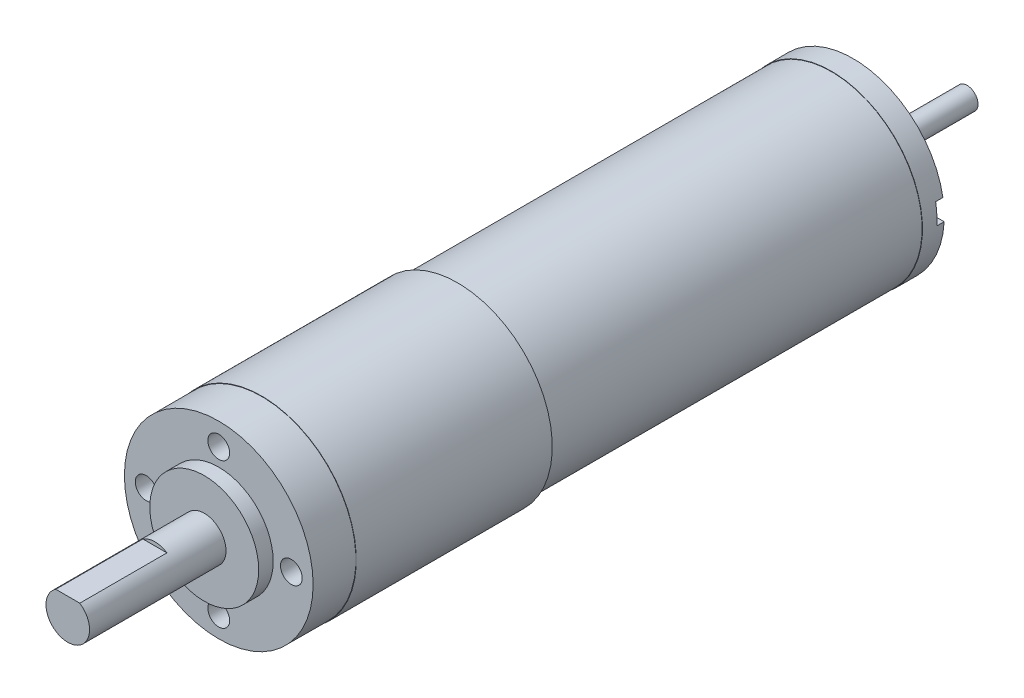
ISO-10303-21;
HEADER;
FILE_DESCRIPTION(('STEP AP214'),'2;1');
FILE_NAME('part.step','',(''),(''),'','','');
FILE_SCHEMA(('AUTOMOTIVE_DESIGN { 1 0 10303 214 1 1 1 1 }'));
ENDSEC;
DATA;
#1=APPLICATION_CONTEXT('core data for automotive mechanical design processes');
#2=APPLICATION_PROTOCOL_DEFINITION('international standard','automotive_design',2000,#1);
#3=PRODUCT_CONTEXT('',#1,'mechanical');
#4=PRODUCT('Part','Part','',(#3));
#5=PRODUCT_RELATED_PRODUCT_CATEGORY('part','',(#4));
#6=PRODUCT_DEFINITION_FORMATION('','',#4);
#7=PRODUCT_DEFINITION_CONTEXT('part definition',#1,'design');
#8=PRODUCT_DEFINITION('design','',#6,#7);
#9=PRODUCT_DEFINITION_SHAPE('','',#8);
#10=(LENGTH_UNIT() NAMED_UNIT(*) SI_UNIT(.MILLI.,.METRE.));
#11=(NAMED_UNIT(*) PLANE_ANGLE_UNIT() SI_UNIT($,.RADIAN.));
#12=(NAMED_UNIT(*) SI_UNIT($,.STERADIAN.) SOLID_ANGLE_UNIT());
#13=UNCERTAINTY_MEASURE_WITH_UNIT(LENGTH_MEASURE(1.E-05),#10,'distance_accuracy_value','');
#14=(GEOMETRIC_REPRESENTATION_CONTEXT(3) GLOBAL_UNCERTAINTY_ASSIGNED_CONTEXT((#13)) GLOBAL_UNIT_ASSIGNED_CONTEXT((#10,
#11,#12)) REPRESENTATION_CONTEXT('',''));
#15=CARTESIAN_POINT('',(0.,0.,0.));
#16=DIRECTION('',(0.,0.,1.));
#17=DIRECTION('',(1.,0.,0.));
#18=AXIS2_PLACEMENT_3D('',#15,#16,#17);
#19=CARTESIAN_POINT('',(0.,0.,54.5));
#20=DIRECTION('',(0.,0.,-1.));
#21=DIRECTION('',(-1.,0.,0.));
#22=AXIS2_PLACEMENT_3D('',#19,#20,#21);
#23=CYLINDRICAL_SURFACE('',#22,12.5);
#24=CARTESIAN_POINT('',(0.,0.,54.5));
#25=DIRECTION('',(0.,0.,1.));
#26=DIRECTION('',(1.,0.,0.));
#27=AXIS2_PLACEMENT_3D('',#24,#25,#26);
#28=CIRCLE('',#27,12.5);
#29=CARTESIAN_POINT('',(12.5,0.,54.5));
#30=VERTEX_POINT('',#29);
#31=EDGE_CURVE('E261',#30,#30,#28,.T.);
#32=ORIENTED_EDGE('',*,*,#31,.F.);
#33=EDGE_LOOP('',(#32));
#34=FACE_BOUND('',#33,.T.);
#35=CARTESIAN_POINT('',(0.,0.,3.));
#36=DIRECTION('',(0.,0.,-1.));
#37=DIRECTION('',(-1.,0.,0.));
#38=AXIS2_PLACEMENT_3D('',#35,#36,#37);
#39=CIRCLE('',#38,12.5);
#40=CARTESIAN_POINT('',(-12.5,0.,3.));
#41=VERTEX_POINT('',#40);
#42=EDGE_CURVE('E11',#41,#41,#39,.T.);
#43=ORIENTED_EDGE('',*,*,#42,.F.);
#44=EDGE_LOOP('',(#43));
#45=FACE_BOUND('',#44,.T.);
#46=ADVANCED_FACE('F34',(#34,#45),#23,.T.);
#47=CARTESIAN_POINT('',(0.,0.,54.5));
#48=DIRECTION('',(0.,0.,1.));
#49=DIRECTION('',(1.,0.,0.));
#50=AXIS2_PLACEMENT_3D('',#47,#48,#49);
#51=PLANE('',#50);
#52=ORIENTED_EDGE('',*,*,#31,.T.);
#53=EDGE_LOOP('',(#52));
#54=FACE_BOUND('',#53,.T.);
#55=CARTESIAN_POINT('',(0.,0.,54.5));
#56=DIRECTION('',(0.,0.,-1.));
#57=DIRECTION('',(-1.,0.,0.));
#58=AXIS2_PLACEMENT_3D('',#55,#56,#57);
#59=CIRCLE('',#58,13.05);
#60=CARTESIAN_POINT('',(-13.05,0.,54.5));
#61=VERTEX_POINT('',#60);
#62=EDGE_CURVE('E199',#61,#61,#59,.T.);
#63=ORIENTED_EDGE('',*,*,#62,.T.);
#64=EDGE_LOOP('',(#63));
#65=FACE_BOUND('',#64,.T.);
#66=ADVANCED_FACE('F299',(#54,#65),#51,.F.);
#67=CARTESIAN_POINT('',(0.,0.,81.5));
#68=DIRECTION('',(0.,0.,-1.));
#69=DIRECTION('',(-1.,0.,0.));
#70=AXIS2_PLACEMENT_3D('',#67,#68,#69);
#71=PLANE('',#70);
#72=CARTESIAN_POINT('',(0.,0.,81.5));
#73=DIRECTION('',(0.,0.,-1.));
#74=DIRECTION('',(-1.,0.,0.));
#75=AXIS2_PLACEMENT_3D('',#72,#73,#74);
#76=CIRCLE('',#75,13.05);
#77=CARTESIAN_POINT('',(-13.05,0.,81.5));
#78=VERTEX_POINT('',#77);
#79=EDGE_CURVE('E203',#78,#78,#76,.T.);
#80=ORIENTED_EDGE('',*,*,#79,.F.);
#81=EDGE_LOOP('',(#80));
#82=FACE_BOUND('',#81,.T.);
#83=CARTESIAN_POINT('',(0.,0.,81.5));
#84=DIRECTION('',(0.,0.,-1.));
#85=DIRECTION('',(-1.,0.,0.));
#86=AXIS2_PLACEMENT_3D('',#83,#84,#85);
#87=CIRCLE('',#86,13.);
#88=CARTESIAN_POINT('',(-13.,0.,81.5));
#89=VERTEX_POINT('',#88);
#90=EDGE_CURVE('E41',#89,#89,#87,.T.);
#91=ORIENTED_EDGE('',*,*,#90,.T.);
#92=EDGE_LOOP('',(#91));
#93=FACE_BOUND('',#92,.T.);
#94=ADVANCED_FACE('F304',(#82,#93),#71,.F.);
#95=CARTESIAN_POINT('',(0.,0.,81.5));
#96=DIRECTION('',(0.,0.,-1.));
#97=DIRECTION('',(-1.,0.,0.));
#98=AXIS2_PLACEMENT_3D('',#95,#96,#97);
#99=CYLINDRICAL_SURFACE('',#98,13.05);
#100=ORIENTED_EDGE('',*,*,#79,.T.);
#101=EDGE_LOOP('',(#100));
#102=FACE_BOUND('',#101,.T.);
#103=ORIENTED_EDGE('',*,*,#62,.F.);
#104=EDGE_LOOP('',(#103));
#105=FACE_BOUND('',#104,.T.);
#106=ADVANCED_FACE('F329',(#102,#105),#99,.T.);
#107=CARTESIAN_POINT('',(0.,0.,96.2));
#108=DIRECTION('',(0.,0.,-1.));
#109=DIRECTION('',(-1.,0.,0.));
#110=AXIS2_PLACEMENT_3D('',#107,#108,#109);
#111=PLANE('',#110);
#112=DIRECTION('',(1.,0.,0.));
#113=VECTOR('',#112,1.);
#114=CARTESIAN_POINT('',(-5.5301112437335,2.5,96.2));
#115=LINE('',#114,#113);
#116=CARTESIAN_POINT('',(-1.6583123951777,2.5,96.2));
#117=VERTEX_POINT('',#116);
#118=CARTESIAN_POINT('',(1.6583123951777,2.5,96.2));
#119=VERTEX_POINT('',#118);
#120=EDGE_CURVE('E232',#117,#119,#115,.T.);
#121=ORIENTED_EDGE('',*,*,#120,.T.);
#122=CARTESIAN_POINT('',(0.,0.,96.2));
#123=DIRECTION('',(0.,0.,-1.));
#124=DIRECTION('',(-1.,0.,0.));
#125=AXIS2_PLACEMENT_3D('',#122,#123,#124);
#126=CIRCLE('',#125,3.);
#127=EDGE_CURVE('E273',#117,#119,#126,.T.);
#128=ORIENTED_EDGE('',*,*,#127,.F.);
#129=EDGE_LOOP('',(#121,#128));
#130=FACE_BOUND('',#129,.T.);
#131=ADVANCED_FACE('F332',(#130),#111,.F.);
#132=CARTESIAN_POINT('',(-5.5301112437335,2.5,96.2));
#133=DIRECTION('',(0.,-1.,0.));
#134=DIRECTION('',(0.,0.,-1.));
#135=AXIS2_PLACEMENT_3D('',#132,#133,#134);
#136=PLANE('',#135);
#137=DIRECTION('',(1.,0.,0.));
#138=VECTOR('',#137,1.);
#139=CARTESIAN_POINT('',(0.,2.5,108.2));
#140=LINE('',#139,#138);
#141=CARTESIAN_POINT('',(-1.6583123951777,2.5,108.2));
#142=VERTEX_POINT('',#141);
#143=CARTESIAN_POINT('',(1.6583123951777,2.5,108.2));
#144=VERTEX_POINT('',#143);
#145=EDGE_CURVE('E267',#142,#144,#140,.T.);
#146=ORIENTED_EDGE('',*,*,#145,.T.);
#147=DIRECTION('',(0.,0.,-1.));
#148=VECTOR('',#147,1.);
#149=CARTESIAN_POINT('',(1.6583123951777,2.5,108.2));
#150=LINE('',#149,#148);
#151=EDGE_CURVE('E235',#119,#144,#150,.F.);
#152=ORIENTED_EDGE('',*,*,#151,.F.);
#153=ORIENTED_EDGE('',*,*,#120,.F.);
#154=DIRECTION('',(0.,0.,-1.));
#155=VECTOR('',#154,1.);
#156=CARTESIAN_POINT('',(-1.6583123951777,2.5,108.2));
#157=LINE('',#156,#155);
#158=EDGE_CURVE('E238',#142,#117,#157,.T.);
#159=ORIENTED_EDGE('',*,*,#158,.F.);
#160=EDGE_LOOP('',(#146,#152,#153,#159));
#161=FACE_BOUND('',#160,.T.);
#162=ADVANCED_FACE('F337',(#161),#136,.F.);
#163=CARTESIAN_POINT('',(0.,0.,108.2));
#164=DIRECTION('',(0.,0.,1.));
#165=DIRECTION('',(1.,0.,0.));
#166=AXIS2_PLACEMENT_3D('',#163,#164,#165);
#167=PLANE('',#166);
#168=ORIENTED_EDGE('',*,*,#145,.F.);
#169=CARTESIAN_POINT('',(0.,0.,108.2));
#170=DIRECTION('',(0.,0.,1.));
#171=DIRECTION('',(1.,0.,0.));
#172=AXIS2_PLACEMENT_3D('',#169,#170,#171);
#173=CIRCLE('',#172,3.);
#174=EDGE_CURVE('E241',#142,#144,#173,.T.);
#175=ORIENTED_EDGE('',*,*,#174,.T.);
#176=EDGE_LOOP('',(#168,#175));
#177=FACE_BOUND('',#176,.T.);
#178=ADVANCED_FACE('F656',(#177),#167,.T.);
#179=CARTESIAN_POINT('',(0.,0.,108.2));
#180=DIRECTION('',(0.,0.,-1.));
#181=DIRECTION('',(-1.,0.,0.));
#182=AXIS2_PLACEMENT_3D('',#179,#180,#181);
#183=CYLINDRICAL_SURFACE('',#182,3.);
#184=ORIENTED_EDGE('',*,*,#174,.F.);
#185=ORIENTED_EDGE('',*,*,#158,.T.);
#186=ORIENTED_EDGE('',*,*,#127,.T.);
#187=ORIENTED_EDGE('',*,*,#151,.T.);
#188=EDGE_LOOP('',(#184,#185,#186,#187));
#189=FACE_BOUND('',#188,.T.);
#190=CARTESIAN_POINT('',(0.,0.,89.4));
#191=DIRECTION('',(0.,0.,1.));
#192=DIRECTION('',(1.,0.,0.));
#193=AXIS2_PLACEMENT_3D('',#190,#191,#192);
#194=CIRCLE('',#193,3.);
#195=CARTESIAN_POINT('',(3.,0.,89.4));
#196=VERTEX_POINT('',#195);
#197=EDGE_CURVE('E244',#196,#196,#194,.F.);
#198=ORIENTED_EDGE('',*,*,#197,.F.);
#199=EDGE_LOOP('',(#198));
#200=FACE_BOUND('',#199,.T.);
#201=ADVANCED_FACE('F670',(#189,#200),#183,.T.);
#202=CARTESIAN_POINT('',(0.,0.,89.4));
#203=DIRECTION('',(0.,0.,1.));
#204=DIRECTION('',(1.,0.,0.));
#205=AXIS2_PLACEMENT_3D('',#202,#203,#204);
#206=PLANE('',#205);
#207=CARTESIAN_POINT('',(0.,0.,89.4));
#208=DIRECTION('',(0.,0.,1.));
#209=DIRECTION('',(1.,0.,0.));
#210=AXIS2_PLACEMENT_3D('',#207,#208,#209);
#211=CIRCLE('',#210,7.5);
#212=CARTESIAN_POINT('',(7.5,0.,89.4));
#213=VERTEX_POINT('',#212);
#214=EDGE_CURVE('E245',#213,#213,#211,.T.);
#215=ORIENTED_EDGE('',*,*,#214,.T.);
#216=EDGE_LOOP('',(#215));
#217=FACE_BOUND('',#216,.T.);
#218=ORIENTED_EDGE('',*,*,#197,.T.);
#219=EDGE_LOOP('',(#218));
#220=FACE_BOUND('',#219,.T.);
#221=ADVANCED_FACE('F360',(#217,#220),#206,.T.);
#222=CARTESIAN_POINT('',(0.,0.,89.4));
#223=DIRECTION('',(0.,0.,-1.));
#224=DIRECTION('',(-1.,0.,0.));
#225=AXIS2_PLACEMENT_3D('',#222,#223,#224);
#226=CYLINDRICAL_SURFACE('',#225,7.5);
#227=ORIENTED_EDGE('',*,*,#214,.F.);
#228=EDGE_LOOP('',(#227));
#229=FACE_BOUND('',#228,.T.);
#230=CARTESIAN_POINT('',(0.,0.,87.4));
#231=DIRECTION('',(0.,0.,1.));
#232=DIRECTION('',(1.,0.,0.));
#233=AXIS2_PLACEMENT_3D('',#230,#231,#232);
#234=CIRCLE('',#233,7.5);
#235=CARTESIAN_POINT('',(7.5,0.,87.4));
#236=VERTEX_POINT('',#235);
#237=EDGE_CURVE('E249',#236,#236,#234,.T.);
#238=ORIENTED_EDGE('',*,*,#237,.T.);
#239=EDGE_LOOP('',(#238));
#240=FACE_BOUND('',#239,.T.);
#241=ADVANCED_FACE('F350',(#229,#240),#226,.T.);
#242=CARTESIAN_POINT('',(0.,0.,87.4));
#243=DIRECTION('',(0.,0.,-1.));
#244=DIRECTION('',(-1.,0.,0.));
#245=AXIS2_PLACEMENT_3D('',#242,#243,#244);
#246=CYLINDRICAL_SURFACE('',#245,13.);
#247=CARTESIAN_POINT('',(0.,0.,87.4));
#248=DIRECTION('',(0.,0.,1.));
#249=DIRECTION('',(1.,0.,0.));
#250=AXIS2_PLACEMENT_3D('',#247,#248,#249);
#251=CIRCLE('',#250,13.);
#252=CARTESIAN_POINT('',(13.,0.,87.4));
#253=VERTEX_POINT('',#252);
#254=EDGE_CURVE('E248',#253,#253,#251,.T.);
#255=ORIENTED_EDGE('',*,*,#254,.F.);
#256=EDGE_LOOP('',(#255));
#257=FACE_BOUND('',#256,.T.);
#258=ORIENTED_EDGE('',*,*,#90,.F.);
#259=EDGE_LOOP('',(#258));
#260=FACE_BOUND('',#259,.T.);
#261=ADVANCED_FACE('F347',(#257,#260),#246,.T.);
#262=CARTESIAN_POINT('',(-9.99972719526156,0.,75.4));
#263=DIRECTION('',(0.,0.,1.));
#264=DIRECTION('',(1.,0.,0.));
#265=AXIS2_PLACEMENT_3D('',#262,#263,#264);
#266=CYLINDRICAL_SURFACE('',#265,1.5);
#267=CARTESIAN_POINT('',(-9.99972719526156,0.,87.4));
#268=DIRECTION('',(0.,0.,1.));
#269=DIRECTION('',(1.,0.,0.));
#270=AXIS2_PLACEMENT_3D('',#267,#268,#269);
#271=CIRCLE('',#270,1.5);
#272=CARTESIAN_POINT('',(-8.49972719526156,0.,87.4));
#273=VERTEX_POINT('',#272);
#274=EDGE_CURVE('E229',#273,#273,#271,.T.);
#275=ORIENTED_EDGE('',*,*,#274,.T.);
#276=EDGE_LOOP('',(#275));
#277=FACE_BOUND('',#276,.T.);
#278=CARTESIAN_POINT('',(-9.99972719526156,0.,81.5));
#279=DIRECTION('',(0.,0.,-1.));
#280=DIRECTION('',(-1.,0.,0.));
#281=AXIS2_PLACEMENT_3D('',#278,#279,#280);
#282=CIRCLE('',#281,1.5);
#283=CARTESIAN_POINT('',(-11.4997271952616,0.,81.5));
#284=VERTEX_POINT('',#283);
#285=EDGE_CURVE('E216',#284,#284,#282,.F.);
#286=ORIENTED_EDGE('',*,*,#285,.F.);
#287=EDGE_LOOP('',(#286));
#288=FACE_BOUND('',#287,.T.);
#289=ADVANCED_FACE('F349',(#277,#288),#266,.F.);
#290=CARTESIAN_POINT('',(9.99972719526156,0.,75.4));
#291=DIRECTION('',(0.,0.,1.));
#292=DIRECTION('',(1.,0.,0.));
#293=AXIS2_PLACEMENT_3D('',#290,#291,#292);
#294=CYLINDRICAL_SURFACE('',#293,1.5);
#295=CARTESIAN_POINT('',(9.99972719526156,0.,87.4));
#296=DIRECTION('',(0.,0.,1.));
#297=DIRECTION('',(1.,0.,0.));
#298=AXIS2_PLACEMENT_3D('',#295,#296,#297);
#299=CIRCLE('',#298,1.5);
#300=CARTESIAN_POINT('',(11.4997271952616,0.,87.4));
#301=VERTEX_POINT('',#300);
#302=EDGE_CURVE('E226',#301,#301,#299,.T.);
#303=ORIENTED_EDGE('',*,*,#302,.T.);
#304=EDGE_LOOP('',(#303));
#305=FACE_BOUND('',#304,.T.);
#306=CARTESIAN_POINT('',(9.99972719526156,0.,81.5));
#307=DIRECTION('',(0.,0.,-1.));
#308=DIRECTION('',(-1.,0.,0.));
#309=AXIS2_PLACEMENT_3D('',#306,#307,#308);
#310=CIRCLE('',#309,1.5);
#311=CARTESIAN_POINT('',(8.49972719526156,0.,81.5));
#312=VERTEX_POINT('',#311);
#313=EDGE_CURVE('E212',#312,#312,#310,.F.);
#314=ORIENTED_EDGE('',*,*,#313,.F.);
#315=EDGE_LOOP('',(#314));
#316=FACE_BOUND('',#315,.T.);
#317=ADVANCED_FACE('F357',(#305,#316),#294,.F.);
#318=CARTESIAN_POINT('',(0.,-10.0738648789778,75.4));
#319=DIRECTION('',(0.,0.,1.));
#320=DIRECTION('',(1.,0.,0.));
#321=AXIS2_PLACEMENT_3D('',#318,#319,#320);
#322=CYLINDRICAL_SURFACE('',#321,1.5);
#323=CARTESIAN_POINT('',(0.,-10.0738648789778,87.4));
#324=DIRECTION('',(0.,0.,1.));
#325=DIRECTION('',(1.,0.,0.));
#326=AXIS2_PLACEMENT_3D('',#323,#324,#325);
#327=CIRCLE('',#326,1.5);
#328=CARTESIAN_POINT('',(1.5,-10.0738648789778,87.4));
#329=VERTEX_POINT('',#328);
#330=EDGE_CURVE('E223',#329,#329,#327,.T.);
#331=ORIENTED_EDGE('',*,*,#330,.T.);
#332=EDGE_LOOP('',(#331));
#333=FACE_BOUND('',#332,.T.);
#334=CARTESIAN_POINT('',(0.,-10.0738648789778,81.5));
#335=DIRECTION('',(0.,0.,-1.));
#336=DIRECTION('',(-1.,0.,0.));
#337=AXIS2_PLACEMENT_3D('',#334,#335,#336);
#338=CIRCLE('',#337,1.5);
#339=CARTESIAN_POINT('',(-1.5,-10.0738648789778,81.5));
#340=VERTEX_POINT('',#339);
#341=EDGE_CURVE('E209',#340,#340,#338,.F.);
#342=ORIENTED_EDGE('',*,*,#341,.F.);
#343=EDGE_LOOP('',(#342));
#344=FACE_BOUND('',#343,.T.);
#345=ADVANCED_FACE('F293',(#333,#344),#322,.F.);
#346=CARTESIAN_POINT('',(0.,0.,87.4));
#347=DIRECTION('',(0.,0.,1.));
#348=DIRECTION('',(1.,0.,0.));
#349=AXIS2_PLACEMENT_3D('',#346,#347,#348);
#350=PLANE('',#349);
#351=CARTESIAN_POINT('',(0.,9.92613512102224,87.4));
#352=DIRECTION('',(0.,0.,1.));
#353=DIRECTION('',(1.,0.,0.));
#354=AXIS2_PLACEMENT_3D('',#351,#352,#353);
#355=CIRCLE('',#354,1.5);
#356=CARTESIAN_POINT('',(1.5,9.92613512102224,87.4));
#357=VERTEX_POINT('',#356);
#358=EDGE_CURVE('E206',#357,#357,#355,.T.);
#359=ORIENTED_EDGE('',*,*,#358,.F.);
#360=EDGE_LOOP('',(#359));
#361=FACE_BOUND('',#360,.T.);
#362=ORIENTED_EDGE('',*,*,#330,.F.);
#363=EDGE_LOOP('',(#362));
#364=FACE_BOUND('',#363,.T.);
#365=ORIENTED_EDGE('',*,*,#302,.F.);
#366=EDGE_LOOP('',(#365));
#367=FACE_BOUND('',#366,.T.);
#368=ORIENTED_EDGE('',*,*,#274,.F.);
#369=EDGE_LOOP('',(#368));
#370=FACE_BOUND('',#369,.T.);
#371=ORIENTED_EDGE('',*,*,#254,.T.);
#372=EDGE_LOOP('',(#371));
#373=FACE_BOUND('',#372,.T.);
#374=ORIENTED_EDGE('',*,*,#237,.F.);
#375=EDGE_LOOP('',(#374));
#376=FACE_BOUND('',#375,.T.);
#377=ADVANCED_FACE('F283',(#361,#364,#367,#370,#373,#376),#350,.T.);
#378=CARTESIAN_POINT('',(0.,9.92613512102224,75.4));
#379=DIRECTION('',(0.,0.,1.));
#380=DIRECTION('',(1.,0.,0.));
#381=AXIS2_PLACEMENT_3D('',#378,#379,#380);
#382=CYLINDRICAL_SURFACE('',#381,1.5);
#383=ORIENTED_EDGE('',*,*,#358,.T.);
#384=EDGE_LOOP('',(#383));
#385=FACE_BOUND('',#384,.T.);
#386=CARTESIAN_POINT('',(0.,9.92613512102224,81.5));
#387=DIRECTION('',(0.,0.,-1.));
#388=DIRECTION('',(-1.,0.,0.));
#389=AXIS2_PLACEMENT_3D('',#386,#387,#388);
#390=CIRCLE('',#389,1.5);
#391=CARTESIAN_POINT('',(-1.5,9.92613512102224,81.5));
#392=VERTEX_POINT('',#391);
#393=EDGE_CURVE('E213',#392,#392,#390,.F.);
#394=ORIENTED_EDGE('',*,*,#393,.F.);
#395=EDGE_LOOP('',(#394));
#396=FACE_BOUND('',#395,.T.);
#397=ADVANCED_FACE('F280',(#385,#396),#382,.F.);
#398=ORIENTED_EDGE('',*,*,#341,.T.);
#399=EDGE_LOOP('',(#398));
#400=FACE_BOUND('',#399,.T.);
#401=ADVANCED_FACE('F282',(#400),#71,.F.);
#402=ORIENTED_EDGE('',*,*,#313,.T.);
#403=EDGE_LOOP('',(#402));
#404=FACE_BOUND('',#403,.T.);
#405=ADVANCED_FACE('F290',(#404),#71,.F.);
#406=ORIENTED_EDGE('',*,*,#285,.T.);
#407=EDGE_LOOP('',(#406));
#408=FACE_BOUND('',#407,.T.);
#409=ADVANCED_FACE('F323',(#408),#71,.F.);
#410=ORIENTED_EDGE('',*,*,#393,.T.);
#411=EDGE_LOOP('',(#410));
#412=FACE_BOUND('',#411,.T.);
#413=ADVANCED_FACE('F278',(#412),#71,.F.);
#414=CARTESIAN_POINT('',(0.,0.,3.));
#415=DIRECTION('',(0.,0.,-1.));
#416=DIRECTION('',(-1.,0.,0.));
#417=AXIS2_PLACEMENT_3D('',#414,#415,#416);
#418=PLANE('',#417);
#419=CARTESIAN_POINT('',(0.,0.,3.));
#420=DIRECTION('',(0.,0.,-1.));
#421=DIRECTION('',(-1.,0.,0.));
#422=AXIS2_PLACEMENT_3D('',#419,#420,#421);
#423=CIRCLE('',#422,12.55);
#424=CARTESIAN_POINT('',(-12.55,0.,3.));
#425=VERTEX_POINT('',#424);
#426=EDGE_CURVE('E196',#425,#425,#423,.T.);
#427=ORIENTED_EDGE('',*,*,#426,.F.);
#428=EDGE_LOOP('',(#427));
#429=FACE_BOUND('',#428,.T.);
#430=ORIENTED_EDGE('',*,*,#42,.T.);
#431=EDGE_LOOP('',(#430));
#432=FACE_BOUND('',#431,.T.);
#433=ADVANCED_FACE('F311',(#429,#432),#418,.F.);
#434=CARTESIAN_POINT('',(0.,0.,3.));
#435=DIRECTION('',(0.,0.,-1.));
#436=DIRECTION('',(-1.,0.,0.));
#437=AXIS2_PLACEMENT_3D('',#434,#435,#436);
#438=CYLINDRICAL_SURFACE('',#437,12.55);
#439=DIRECTION('',(0.,0.,-1.));
#440=VECTOR('',#439,1.);
#441=CARTESIAN_POINT('',(12.5331560271146,-0.650000000000005,1.));
#442=LINE('',#441,#440);
#443=CARTESIAN_POINT('',(12.5331560271146,-0.650000000000005,1.));
#444=VERTEX_POINT('',#443);
#445=CARTESIAN_POINT('',(12.5331560271146,-0.650000000000005,0.));
#446=VERTEX_POINT('',#445);
#447=EDGE_CURVE('E141',#444,#446,#442,.T.);
#448=ORIENTED_EDGE('',*,*,#447,.F.);
#449=CARTESIAN_POINT('',(-1.40165656858926E-12,0.,1.));
#450=DIRECTION('',(0.,0.,-1.));
#451=DIRECTION('',(-1.,0.,0.));
#452=AXIS2_PLACEMENT_3D('',#449,#450,#451);
#453=CIRCLE('',#452,12.5500000000014);
#454=CARTESIAN_POINT('',(12.364465212859,2.15,1.));
#455=VERTEX_POINT('',#454);
#456=EDGE_CURVE('E125',#455,#444,#453,.T.);
#457=ORIENTED_EDGE('',*,*,#456,.F.);
#458=DIRECTION('',(0.,0.,-1.));
#459=VECTOR('',#458,1.);
#460=CARTESIAN_POINT('',(12.364465212859,2.15,1.));
#461=LINE('',#460,#459);
#462=CARTESIAN_POINT('',(12.364465212859,2.15,0.));
#463=VERTEX_POINT('',#462);
#464=EDGE_CURVE('E116',#455,#463,#461,.T.);
#465=ORIENTED_EDGE('',*,*,#464,.T.);
#466=CARTESIAN_POINT('',(0.,0.,0.));
#467=DIRECTION('',(0.,0.,-1.));
#468=DIRECTION('',(-1.,0.,0.));
#469=AXIS2_PLACEMENT_3D('',#466,#467,#468);
#470=CIRCLE('',#469,12.55);
#471=CARTESIAN_POINT('',(-12.364465212859,2.14999999999999,0.));
#472=VERTEX_POINT('',#471);
#473=EDGE_CURVE('E200',#472,#463,#470,.T.);
#474=ORIENTED_EDGE('',*,*,#473,.F.);
#475=DIRECTION('',(0.,0.,-1.));
#476=VECTOR('',#475,1.);
#477=CARTESIAN_POINT('',(-12.364465212859,2.14999999999999,1.));
#478=LINE('',#477,#476);
#479=CARTESIAN_POINT('',(-12.364465212859,2.14999999999999,1.));
#480=VERTEX_POINT('',#479);
#481=EDGE_CURVE('E166',#480,#472,#478,.T.);
#482=ORIENTED_EDGE('',*,*,#481,.F.);
#483=CARTESIAN_POINT('',(3.07046055247895E-13,0.,1.));
#484=DIRECTION('',(0.,0.,-1.));
#485=DIRECTION('',(-1.,0.,0.));
#486=AXIS2_PLACEMENT_3D('',#483,#484,#485);
#487=CIRCLE('',#486,12.5500000000003);
#488=CARTESIAN_POINT('',(-12.5331560271146,-0.65000000000001,1.));
#489=VERTEX_POINT('',#488);
#490=EDGE_CURVE('E151',#489,#480,#487,.T.);
#491=ORIENTED_EDGE('',*,*,#490,.F.);
#492=DIRECTION('',(0.,0.,-1.));
#493=VECTOR('',#492,1.);
#494=CARTESIAN_POINT('',(-12.5331560271146,-0.65000000000001,1.));
#495=LINE('',#494,#493);
#496=CARTESIAN_POINT('',(-12.5331560271146,-0.65000000000001,0.));
#497=VERTEX_POINT('',#496);
#498=EDGE_CURVE('E168',#489,#497,#495,.T.);
#499=ORIENTED_EDGE('',*,*,#498,.T.);
#500=EDGE_CURVE('E193',#446,#497,#470,.T.);
#501=ORIENTED_EDGE('',*,*,#500,.F.);
#502=EDGE_LOOP('',(#448,#457,#465,#474,#482,#491,#499,#501));
#503=FACE_BOUND('',#502,.T.);
#504=ORIENTED_EDGE('',*,*,#426,.T.);
#505=EDGE_LOOP('',(#504));
#506=FACE_BOUND('',#505,.T.);
#507=ADVANCED_FACE('F313',(#503,#506),#438,.T.);
#508=CARTESIAN_POINT('',(0.,0.,-15.7));
#509=DIRECTION('',(0.,0.,-1.));
#510=DIRECTION('',(-1.,0.,0.));
#511=AXIS2_PLACEMENT_3D('',#508,#509,#510);
#512=PLANE('',#511);
#513=CARTESIAN_POINT('',(0.,0.,-15.7));
#514=DIRECTION('',(0.,0.,-1.));
#515=DIRECTION('',(-1.,0.,0.));
#516=AXIS2_PLACEMENT_3D('',#513,#514,#515);
#517=CIRCLE('',#516,1.5);
#518=CARTESIAN_POINT('',(-1.5,0.,-15.7));
#519=VERTEX_POINT('',#518);
#520=EDGE_CURVE('E254',#519,#519,#517,.T.);
#521=ORIENTED_EDGE('',*,*,#520,.T.);
#522=EDGE_LOOP('',(#521));
#523=FACE_BOUND('',#522,.T.);
#524=ADVANCED_FACE('F320',(#523),#512,.T.);
#525=CARTESIAN_POINT('',(0.,0.,-15.7));
#526=DIRECTION('',(0.,0.,1.));
#527=DIRECTION('',(1.,0.,0.));
#528=AXIS2_PLACEMENT_3D('',#525,#526,#527);
#529=CYLINDRICAL_SURFACE('',#528,1.5);
#530=CARTESIAN_POINT('',(0.,0.,-1.35));
#531=DIRECTION('',(0.,0.,-1.));
#532=DIRECTION('',(-1.,0.,0.));
#533=AXIS2_PLACEMENT_3D('',#530,#531,#532);
#534=CIRCLE('',#533,1.5);
#535=CARTESIAN_POINT('',(-1.5,0.,-1.35));
#536=VERTEX_POINT('',#535);
#537=EDGE_CURVE('E257',#536,#536,#534,.F.);
#538=ORIENTED_EDGE('',*,*,#537,.F.);
#539=EDGE_LOOP('',(#538));
#540=FACE_BOUND('',#539,.T.);
#541=ORIENTED_EDGE('',*,*,#520,.F.);
#542=EDGE_LOOP('',(#541));
#543=FACE_BOUND('',#542,.T.);
#544=ADVANCED_FACE('F367',(#540,#543),#529,.T.);
#545=CARTESIAN_POINT('',(0.,0.,-1.35));
#546=DIRECTION('',(0.,0.,-1.));
#547=DIRECTION('',(-1.,0.,0.));
#548=AXIS2_PLACEMENT_3D('',#545,#546,#547);
#549=PLANE('',#548);
#550=CARTESIAN_POINT('',(0.,0.,-1.35));
#551=DIRECTION('',(0.,0.,-1.));
#552=DIRECTION('',(-1.,0.,0.));
#553=AXIS2_PLACEMENT_3D('',#550,#551,#552);
#554=CIRCLE('',#553,4.);
#555=CARTESIAN_POINT('',(4.,0.,-1.35));
#556=VERTEX_POINT('',#555);
#557=EDGE_CURVE('E258',#556,#556,#554,.T.);
#558=ORIENTED_EDGE('',*,*,#557,.T.);
#559=EDGE_LOOP('',(#558));
#560=FACE_BOUND('',#559,.T.);
#561=ORIENTED_EDGE('',*,*,#537,.T.);
#562=EDGE_LOOP('',(#561));
#563=FACE_BOUND('',#562,.T.);
#564=ADVANCED_FACE('F371',(#560,#563),#549,.T.);
#565=CARTESIAN_POINT('',(0.,0.,-1.35));
#566=DIRECTION('',(0.,0.,1.));
#567=DIRECTION('',(1.,0.,0.));
#568=AXIS2_PLACEMENT_3D('',#565,#566,#567);
#569=CYLINDRICAL_SURFACE('',#568,4.);
#570=CARTESIAN_POINT('',(0.,0.,0.));
#571=DIRECTION('',(0.,0.,1.));
#572=DIRECTION('',(1.,0.,0.));
#573=AXIS2_PLACEMENT_3D('',#570,#571,#572);
#574=CIRCLE('',#573,4.);
#575=CARTESIAN_POINT('',(4.,0.,0.));
#576=VERTEX_POINT('',#575);
#577=EDGE_CURVE('E264',#576,#576,#574,.F.);
#578=CARTESIAN_POINT('',(4.,0.,-1.35));
#579=CARTESIAN_POINT('',(4.,0.,-1.3359375));
#580=CARTESIAN_POINT('',(4.,0.,-1.321875));
#581=CARTESIAN_POINT('',(4.,0.,-1.29375));
#582=CARTESIAN_POINT('',(4.,0.,-1.2796875));
#583=CARTESIAN_POINT('',(4.,0.,-1.2515625));
#584=CARTESIAN_POINT('',(4.,0.,-1.2375));
#585=CARTESIAN_POINT('',(4.,0.,-1.209375));
#586=CARTESIAN_POINT('',(4.,0.,-1.1953125));
#587=CARTESIAN_POINT('',(4.,0.,-1.1671875));
#588=CARTESIAN_POINT('',(4.,0.,-1.153125));
#589=CARTESIAN_POINT('',(4.,0.,-1.125));
#590=CARTESIAN_POINT('',(4.,0.,-1.1109375));
#591=CARTESIAN_POINT('',(4.,0.,-1.0828125));
#592=CARTESIAN_POINT('',(4.,0.,-1.06875));
#593=CARTESIAN_POINT('',(4.,0.,-1.040625));
#594=CARTESIAN_POINT('',(4.,0.,-1.0265625));
#595=CARTESIAN_POINT('',(4.,0.,-0.9984375));
#596=CARTESIAN_POINT('',(4.,0.,-0.984375));
#597=CARTESIAN_POINT('',(4.,0.,-0.95625));
#598=CARTESIAN_POINT('',(4.,0.,-0.9421875));
#599=CARTESIAN_POINT('',(4.,0.,-0.9140625));
#600=CARTESIAN_POINT('',(4.,0.,-0.9));
#601=CARTESIAN_POINT('',(4.,0.,-0.871875));
#602=CARTESIAN_POINT('',(4.,0.,-0.8578125));
#603=CARTESIAN_POINT('',(4.,0.,-0.8296875));
#604=CARTESIAN_POINT('',(4.,0.,-0.815625));
#605=CARTESIAN_POINT('',(4.,0.,-0.7875));
#606=CARTESIAN_POINT('',(4.,0.,-0.7734375));
#607=CARTESIAN_POINT('',(4.,0.,-0.7453125));
#608=CARTESIAN_POINT('',(4.,0.,-0.73125));
#609=CARTESIAN_POINT('',(4.,0.,-0.703125));
#610=CARTESIAN_POINT('',(4.,0.,-0.6890625));
#611=CARTESIAN_POINT('',(4.,0.,-0.6609375));
#612=CARTESIAN_POINT('',(4.,0.,-0.646875));
#613=CARTESIAN_POINT('',(4.,0.,-0.61875));
#614=CARTESIAN_POINT('',(4.,0.,-0.6046875));
#615=CARTESIAN_POINT('',(4.,0.,-0.5765625));
#616=CARTESIAN_POINT('',(4.,0.,-0.5625));
#617=CARTESIAN_POINT('',(4.,0.,-0.534375));
#618=CARTESIAN_POINT('',(4.,0.,-0.5203125));
#619=CARTESIAN_POINT('',(4.,0.,-0.4921875));
#620=CARTESIAN_POINT('',(4.,0.,-0.478125));
#621=CARTESIAN_POINT('',(4.,0.,-0.45));
#622=CARTESIAN_POINT('',(4.,0.,-0.4359375));
#623=CARTESIAN_POINT('',(4.,0.,-0.4078125));
#624=CARTESIAN_POINT('',(4.,0.,-0.39375));
#625=CARTESIAN_POINT('',(4.,0.,-0.365625));
#626=CARTESIAN_POINT('',(4.,0.,-0.3515625));
#627=CARTESIAN_POINT('',(4.,0.,-0.3234375));
#628=CARTESIAN_POINT('',(4.,0.,-0.309375));
#629=CARTESIAN_POINT('',(4.,0.,-0.28125));
#630=CARTESIAN_POINT('',(4.,0.,-0.2671875));
#631=CARTESIAN_POINT('',(4.,0.,-0.2390625));
#632=CARTESIAN_POINT('',(4.,0.,-0.225));
#633=CARTESIAN_POINT('',(4.,0.,-0.196875));
#634=CARTESIAN_POINT('',(4.,0.,-0.1828125));
#635=CARTESIAN_POINT('',(4.,0.,-0.1546875));
#636=CARTESIAN_POINT('',(4.,0.,-0.140625));
#637=CARTESIAN_POINT('',(4.,0.,-0.1125));
#638=CARTESIAN_POINT('',(4.,0.,-0.0984375000000002));
#639=CARTESIAN_POINT('',(4.,0.,-0.0703125000000002));
#640=CARTESIAN_POINT('',(4.,0.,-0.0562500000000002));
#641=CARTESIAN_POINT('',(4.,0.,-0.0281250000000002));
#642=CARTESIAN_POINT('',(4.,0.,-0.0140625000000002));
#643=CARTESIAN_POINT('',(4.,0.,0.));
#644=B_SPLINE_CURVE_WITH_KNOTS('',3,(#578,#579,#580,#581,#582,#583,#584,#585,#586,#587,#588,
#589,#590,#591,#592,#593,#594,#595,#596,#597,#598,#599,#600,#601,#602,#603,#604,#605,#606,#607,
#608,#609,#610,#611,#612,#613,#614,#615,#616,#617,#618,#619,#620,#621,#622,#623,#624,#625,#626,
#627,#628,#629,#630,#631,#632,#633,#634,#635,#636,#637,#638,#639,#640,#641,#642,#643),
.UNSPECIFIED.,.F.,.F.,(4,2,2,2,2,2,2,2,2,2,2,2,2,2,2,2,2,2,2,2,2,2,2,2,2,2,2,2,2,2,2,2,4),(0.,
0.0421874999999999,0.0843749999999998,0.1265625,0.16875,0.2109375,0.253125,0.2953125,0.3375,
0.3796875,0.421875,0.4640625,0.50625,0.5484375,0.590625,0.6328125,0.675,0.7171875,0.759375,
0.8015625,0.84375,0.8859375,0.928125,0.9703125,1.0125,1.0546875,1.096875,1.1390625,1.18125,
1.2234375,1.265625,1.3078125,1.35),.UNSPECIFIED.);
#645=EDGE_CURVE('BSEAM375',#556,#576,#644,.T.);
#646=ORIENTED_EDGE('',*,*,#557,.F.);
#647=ORIENTED_EDGE('',*,*,#577,.T.);
#648=ORIENTED_EDGE('',*,*,#645,.T.);
#649=ORIENTED_EDGE('',*,*,#645,.F.);
#650=EDGE_LOOP('',(#646,#648,#647,#649));
#651=FACE_BOUND('',#650,.T.);
#652=ADVANCED_FACE('F375',(#651),#569,.T.);
#653=CARTESIAN_POINT('',(0.,0.,0.));
#654=DIRECTION('',(0.,0.,1.));
#655=DIRECTION('',(1.,0.,0.));
#656=AXIS2_PLACEMENT_3D('',#653,#654,#655);
#657=PLANE('',#656);
#658=CARTESIAN_POINT('',(7.36121593216774,-4.24999999999998,0.));
#659=DIRECTION('',(0.,0.,-1.));
#660=DIRECTION('',(-1.,0.,0.));
#661=AXIS2_PLACEMENT_3D('',#658,#659,#660);
#662=CIRCLE('',#661,1.);
#663=CARTESIAN_POINT('',(6.36121593216774,-4.24999999999998,0.));
#664=VERTEX_POINT('',#663);
#665=EDGE_CURVE('E165',#664,#664,#662,.T.);
#666=ORIENTED_EDGE('',*,*,#665,.F.);
#667=EDGE_LOOP('',(#666));
#668=FACE_BOUND('',#667,.T.);
#669=CARTESIAN_POINT('',(0.,-8.5,0.));
#670=DIRECTION('',(0.,0.,-1.));
#671=DIRECTION('',(-1.,0.,0.));
#672=AXIS2_PLACEMENT_3D('',#669,#670,#671);
#673=CIRCLE('',#672,1.);
#674=CARTESIAN_POINT('',(-1.,-8.5,0.));
#675=VERTEX_POINT('',#674);
#676=EDGE_CURVE('E175',#675,#675,#673,.T.);
#677=ORIENTED_EDGE('',*,*,#676,.F.);
#678=EDGE_LOOP('',(#677));
#679=FACE_BOUND('',#678,.T.);
#680=CARTESIAN_POINT('',(-7.36121593216774,-4.24999999999998,0.));
#681=DIRECTION('',(0.,0.,-1.));
#682=DIRECTION('',(-1.,0.,0.));
#683=AXIS2_PLACEMENT_3D('',#680,#681,#682);
#684=CIRCLE('',#683,1.);
#685=CARTESIAN_POINT('',(-8.36121593216774,-4.24999999999998,0.));
#686=VERTEX_POINT('',#685);
#687=EDGE_CURVE('E181',#686,#686,#684,.T.);
#688=ORIENTED_EDGE('',*,*,#687,.F.);
#689=EDGE_LOOP('',(#688));
#690=FACE_BOUND('',#689,.T.);
#691=CARTESIAN_POINT('',(0.,8.5,0.));
#692=DIRECTION('',(0.,0.,-1.));
#693=DIRECTION('',(-1.,0.,0.));
#694=AXIS2_PLACEMENT_3D('',#691,#692,#693);
#695=CIRCLE('',#694,1.);
#696=CARTESIAN_POINT('',(-1.,8.5,0.));
#697=VERTEX_POINT('',#696);
#698=EDGE_CURVE('E187',#697,#697,#695,.T.);
#699=ORIENTED_EDGE('',*,*,#698,.F.);
#700=EDGE_LOOP('',(#699));
#701=FACE_BOUND('',#700,.T.);
#702=ORIENTED_EDGE('',*,*,#577,.F.);
#703=EDGE_LOOP('',(#702));
#704=FACE_BOUND('',#703,.T.);
#705=DIRECTION('',(0.,1.,0.));
#706=VECTOR('',#705,1.);
#707=CARTESIAN_POINT('',(10.0688283712884,-0.650000000000005,0.));
#708=LINE('',#707,#706);
#709=CARTESIAN_POINT('',(10.0688283712884,-0.650000000000005,0.));
#710=VERTEX_POINT('',#709);
#711=CARTESIAN_POINT('',(10.0688283712884,2.15,0.));
#712=VERTEX_POINT('',#711);
#713=EDGE_CURVE('E48',#710,#712,#708,.T.);
#714=ORIENTED_EDGE('',*,*,#713,.F.);
#715=DIRECTION('',(-1.,0.,0.));
#716=VECTOR('',#715,1.);
#717=CARTESIAN_POINT('',(12.5331560271146,-0.650000000000005,0.));
#718=LINE('',#717,#716);
#719=EDGE_CURVE('E129',#446,#710,#718,.T.);
#720=ORIENTED_EDGE('',*,*,#719,.F.);
#721=ORIENTED_EDGE('',*,*,#500,.T.);
#722=DIRECTION('',(-1.,0.,0.));
#723=VECTOR('',#722,1.);
#724=CARTESIAN_POINT('',(-10.0059288264731,-0.650000000000005,0.));
#725=LINE('',#724,#723);
#726=CARTESIAN_POINT('',(-10.0059288264731,-0.650000000000005,0.));
#727=VERTEX_POINT('',#726);
#728=EDGE_CURVE('E158',#727,#497,#725,.T.);
#729=ORIENTED_EDGE('',*,*,#728,.F.);
#730=DIRECTION('',(0.,-1.,0.));
#731=VECTOR('',#730,1.);
#732=CARTESIAN_POINT('',(-10.0059288264731,2.14999999999999,0.));
#733=LINE('',#732,#731);
#734=CARTESIAN_POINT('',(-10.0059288264731,2.14999999999999,0.));
#735=VERTEX_POINT('',#734);
#736=EDGE_CURVE('E56',#735,#727,#733,.T.);
#737=ORIENTED_EDGE('',*,*,#736,.F.);
#738=DIRECTION('',(1.,0.,0.));
#739=VECTOR('',#738,1.);
#740=CARTESIAN_POINT('',(-12.364465212859,2.14999999999999,0.));
#741=LINE('',#740,#739);
#742=EDGE_CURVE('E148',#472,#735,#741,.T.);
#743=ORIENTED_EDGE('',*,*,#742,.F.);
#744=ORIENTED_EDGE('',*,*,#473,.T.);
#745=DIRECTION('',(1.,0.,0.));
#746=VECTOR('',#745,1.);
#747=CARTESIAN_POINT('',(10.0688283712884,2.15,0.));
#748=LINE('',#747,#746);
#749=EDGE_CURVE('E132',#712,#463,#748,.T.);
#750=ORIENTED_EDGE('',*,*,#749,.F.);
#751=EDGE_LOOP('',(#714,#720,#721,#729,#737,#743,#744,#750));
#752=FACE_BOUND('',#751,.T.);
#753=ADVANCED_FACE('F378',(#668,#679,#690,#701,#704,#752),#657,.F.);
#754=CARTESIAN_POINT('',(0.,8.5,1.));
#755=DIRECTION('',(0.,0.,-1.));
#756=DIRECTION('',(-1.,0.,0.));
#757=AXIS2_PLACEMENT_3D('',#754,#755,#756);
#758=CYLINDRICAL_SURFACE('',#757,1.);
#759=CARTESIAN_POINT('',(0.,8.5,1.));
#760=DIRECTION('',(0.,0.,-1.));
#761=DIRECTION('',(-1.,0.,0.));
#762=AXIS2_PLACEMENT_3D('',#759,#760,#761);
#763=CIRCLE('',#762,1.);
#764=CARTESIAN_POINT('',(-1.,8.5,1.));
#765=VERTEX_POINT('',#764);
#766=EDGE_CURVE('E190',#765,#765,#763,.T.);
#767=ORIENTED_EDGE('',*,*,#766,.F.);
#768=EDGE_LOOP('',(#767));
#769=FACE_BOUND('',#768,.T.);
#770=ORIENTED_EDGE('',*,*,#698,.T.);
#771=EDGE_LOOP('',(#770));
#772=FACE_BOUND('',#771,.T.);
#773=ADVANCED_FACE('F326',(#769,#772),#758,.F.);
#774=CARTESIAN_POINT('',(0.,8.5,1.));
#775=DIRECTION('',(0.,0.,-1.));
#776=DIRECTION('',(-1.,0.,0.));
#777=AXIS2_PLACEMENT_3D('',#774,#775,#776);
#778=PLANE('',#777);
#779=ORIENTED_EDGE('',*,*,#766,.T.);
#780=EDGE_LOOP('',(#779));
#781=FACE_BOUND('',#780,.T.);
#782=ADVANCED_FACE('F385',(#781),#778,.T.);
#783=CARTESIAN_POINT('',(-7.36121593216774,-4.24999999999998,1.));
#784=DIRECTION('',(0.,0.,-1.));
#785=DIRECTION('',(-1.,0.,0.));
#786=AXIS2_PLACEMENT_3D('',#783,#784,#785);
#787=CYLINDRICAL_SURFACE('',#786,1.);
#788=CARTESIAN_POINT('',(-7.36121593216774,-4.24999999999998,1.));
#789=DIRECTION('',(0.,0.,-1.));
#790=DIRECTION('',(-1.,0.,0.));
#791=AXIS2_PLACEMENT_3D('',#788,#789,#790);
#792=CIRCLE('',#791,1.);
#793=CARTESIAN_POINT('',(-8.36121593216774,-4.24999999999998,1.));
#794=VERTEX_POINT('',#793);
#795=EDGE_CURVE('E184',#794,#794,#792,.T.);
#796=ORIENTED_EDGE('',*,*,#795,.F.);
#797=EDGE_LOOP('',(#796));
#798=FACE_BOUND('',#797,.T.);
#799=ORIENTED_EDGE('',*,*,#687,.T.);
#800=EDGE_LOOP('',(#799));
#801=FACE_BOUND('',#800,.T.);
#802=ADVANCED_FACE('F450',(#798,#801),#787,.F.);
#803=CARTESIAN_POINT('',(-7.36121593216774,-4.24999999999998,1.));
#804=DIRECTION('',(0.,0.,-1.));
#805=DIRECTION('',(-1.,0.,0.));
#806=AXIS2_PLACEMENT_3D('',#803,#804,#805);
#807=PLANE('',#806);
#808=ORIENTED_EDGE('',*,*,#795,.T.);
#809=EDGE_LOOP('',(#808));
#810=FACE_BOUND('',#809,.T.);
#811=ADVANCED_FACE('F446',(#810),#807,.T.);
#812=CARTESIAN_POINT('',(0.,-8.5,1.));
#813=DIRECTION('',(0.,0.,-1.));
#814=DIRECTION('',(-1.,0.,0.));
#815=AXIS2_PLACEMENT_3D('',#812,#813,#814);
#816=CYLINDRICAL_SURFACE('',#815,1.);
#817=CARTESIAN_POINT('',(0.,-8.5,1.));
#818=DIRECTION('',(0.,0.,-1.));
#819=DIRECTION('',(-1.,0.,0.));
#820=AXIS2_PLACEMENT_3D('',#817,#818,#819);
#821=CIRCLE('',#820,1.);
#822=CARTESIAN_POINT('',(-1.,-8.5,1.));
#823=VERTEX_POINT('',#822);
#824=EDGE_CURVE('E178',#823,#823,#821,.T.);
#825=ORIENTED_EDGE('',*,*,#824,.F.);
#826=EDGE_LOOP('',(#825));
#827=FACE_BOUND('',#826,.T.);
#828=ORIENTED_EDGE('',*,*,#676,.T.);
#829=EDGE_LOOP('',(#828));
#830=FACE_BOUND('',#829,.T.);
#831=ADVANCED_FACE('F442',(#827,#830),#816,.F.);
#832=CARTESIAN_POINT('',(0.,-8.5,1.));
#833=DIRECTION('',(0.,0.,-1.));
#834=DIRECTION('',(-1.,0.,0.));
#835=AXIS2_PLACEMENT_3D('',#832,#833,#834);
#836=PLANE('',#835);
#837=ORIENTED_EDGE('',*,*,#824,.T.);
#838=EDGE_LOOP('',(#837));
#839=FACE_BOUND('',#838,.T.);
#840=ADVANCED_FACE('F438',(#839),#836,.T.);
#841=CARTESIAN_POINT('',(7.36121593216774,-4.24999999999998,1.));
#842=DIRECTION('',(0.,0.,-1.));
#843=DIRECTION('',(-1.,0.,0.));
#844=AXIS2_PLACEMENT_3D('',#841,#842,#843);
#845=CYLINDRICAL_SURFACE('',#844,1.);
#846=CARTESIAN_POINT('',(7.36121593216774,-4.24999999999998,1.));
#847=DIRECTION('',(0.,0.,-1.));
#848=DIRECTION('',(-1.,0.,0.));
#849=AXIS2_PLACEMENT_3D('',#846,#847,#848);
#850=CIRCLE('',#849,1.);
#851=CARTESIAN_POINT('',(6.36121593216774,-4.24999999999998,1.));
#852=VERTEX_POINT('',#851);
#853=EDGE_CURVE('E172',#852,#852,#850,.T.);
#854=ORIENTED_EDGE('',*,*,#853,.F.);
#855=EDGE_LOOP('',(#854));
#856=FACE_BOUND('',#855,.T.);
#857=ORIENTED_EDGE('',*,*,#665,.T.);
#858=EDGE_LOOP('',(#857));
#859=FACE_BOUND('',#858,.T.);
#860=ADVANCED_FACE('F434',(#856,#859),#845,.F.);
#861=CARTESIAN_POINT('',(7.36121593216774,-4.24999999999998,1.));
#862=DIRECTION('',(0.,0.,-1.));
#863=DIRECTION('',(-1.,0.,0.));
#864=AXIS2_PLACEMENT_3D('',#861,#862,#863);
#865=PLANE('',#864);
#866=ORIENTED_EDGE('',*,*,#853,.T.);
#867=EDGE_LOOP('',(#866));
#868=FACE_BOUND('',#867,.T.);
#869=ADVANCED_FACE('F431',(#868),#865,.T.);
#870=CARTESIAN_POINT('',(-10.0059288264731,2.14999999999999,1.));
#871=DIRECTION('',(1.,0.,0.));
#872=DIRECTION('',(0.,0.,-1.));
#873=AXIS2_PLACEMENT_3D('',#870,#871,#872);
#874=PLANE('',#873);
#875=ORIENTED_EDGE('',*,*,#736,.T.);
#876=DIRECTION('',(0.,0.,-1.));
#877=VECTOR('',#876,1.);
#878=CARTESIAN_POINT('',(-10.0059288264731,-0.650000000000005,1.));
#879=LINE('',#878,#877);
#880=CARTESIAN_POINT('',(-10.0059288264731,-0.650000000000005,1.));
#881=VERTEX_POINT('',#880);
#882=EDGE_CURVE('E156',#881,#727,#879,.T.);
#883=ORIENTED_EDGE('',*,*,#882,.F.);
#884=DIRECTION('',(0.,-1.,0.));
#885=VECTOR('',#884,1.);
#886=CARTESIAN_POINT('',(-10.0059288264731,2.14999999999999,1.));
#887=LINE('',#886,#885);
#888=CARTESIAN_POINT('',(-10.0059288264731,2.14999999999999,1.));
#889=VERTEX_POINT('',#888);
#890=EDGE_CURVE('E144',#889,#881,#887,.T.);
#891=ORIENTED_EDGE('',*,*,#890,.F.);
#892=DIRECTION('',(0.,0.,-1.));
#893=VECTOR('',#892,1.);
#894=CARTESIAN_POINT('',(-10.0059288264731,2.14999999999999,1.));
#895=LINE('',#894,#893);
#896=EDGE_CURVE('E163',#889,#735,#895,.T.);
#897=ORIENTED_EDGE('',*,*,#896,.T.);
#898=EDGE_LOOP('',(#875,#883,#891,#897));
#899=FACE_BOUND('',#898,.T.);
#900=ADVANCED_FACE('F424',(#899),#874,.F.);
#901=CARTESIAN_POINT('',(-12.364465212859,2.14999999999999,1.));
#902=DIRECTION('',(0.,1.,0.));
#903=DIRECTION('',(0.,0.,1.));
#904=AXIS2_PLACEMENT_3D('',#901,#902,#903);
#905=PLANE('',#904);
#906=ORIENTED_EDGE('',*,*,#742,.T.);
#907=ORIENTED_EDGE('',*,*,#896,.F.);
#908=DIRECTION('',(1.,0.,0.));
#909=VECTOR('',#908,1.);
#910=CARTESIAN_POINT('',(-12.364465212859,2.14999999999999,1.));
#911=LINE('',#910,#909);
#912=EDGE_CURVE('E153',#480,#889,#911,.T.);
#913=ORIENTED_EDGE('',*,*,#912,.F.);
#914=ORIENTED_EDGE('',*,*,#481,.T.);
#915=EDGE_LOOP('',(#906,#907,#913,#914));
#916=FACE_BOUND('',#915,.T.);
#917=ADVANCED_FACE('F421',(#916),#905,.F.);
#918=CARTESIAN_POINT('',(-10.0059288264731,-0.650000000000005,1.));
#919=DIRECTION('',(0.,-1.,0.));
#920=DIRECTION('',(0.,0.,-1.));
#921=AXIS2_PLACEMENT_3D('',#918,#919,#920);
#922=PLANE('',#921);
#923=ORIENTED_EDGE('',*,*,#728,.T.);
#924=ORIENTED_EDGE('',*,*,#498,.F.);
#925=DIRECTION('',(-1.,0.,0.));
#926=VECTOR('',#925,1.);
#927=CARTESIAN_POINT('',(-10.0059288264731,-0.650000000000005,1.));
#928=LINE('',#927,#926);
#929=EDGE_CURVE('E147',#881,#489,#928,.T.);
#930=ORIENTED_EDGE('',*,*,#929,.F.);
#931=ORIENTED_EDGE('',*,*,#882,.T.);
#932=EDGE_LOOP('',(#923,#924,#930,#931));
#933=FACE_BOUND('',#932,.T.);
#934=ADVANCED_FACE('F419',(#933),#922,.F.);
#935=CARTESIAN_POINT('',(3.07046055247895E-13,0.,1.));
#936=DIRECTION('',(0.,0.,-1.));
#937=DIRECTION('',(-1.,0.,0.));
#938=AXIS2_PLACEMENT_3D('',#935,#936,#937);
#939=PLANE('',#938);
#940=ORIENTED_EDGE('',*,*,#890,.T.);
#941=ORIENTED_EDGE('',*,*,#929,.T.);
#942=ORIENTED_EDGE('',*,*,#490,.T.);
#943=ORIENTED_EDGE('',*,*,#912,.T.);
#944=EDGE_LOOP('',(#940,#941,#942,#943));
#945=FACE_BOUND('',#944,.T.);
#946=ADVANCED_FACE('F413',(#945),#939,.T.);
#947=CARTESIAN_POINT('',(10.0688283712884,-0.650000000000005,1.));
#948=DIRECTION('',(-1.,0.,0.));
#949=DIRECTION('',(0.,0.,1.));
#950=AXIS2_PLACEMENT_3D('',#947,#948,#949);
#951=PLANE('',#950);
#952=ORIENTED_EDGE('',*,*,#713,.T.);
#953=DIRECTION('',(0.,0.,-1.));
#954=VECTOR('',#953,1.);
#955=CARTESIAN_POINT('',(10.0688283712884,2.15,1.));
#956=LINE('',#955,#954);
#957=CARTESIAN_POINT('',(10.0688283712884,2.15,1.));
#958=VERTEX_POINT('',#957);
#959=EDGE_CURVE('E108',#958,#712,#956,.T.);
#960=ORIENTED_EDGE('',*,*,#959,.F.);
#961=DIRECTION('',(0.,1.,0.));
#962=VECTOR('',#961,1.);
#963=CARTESIAN_POINT('',(10.0688283712884,-0.650000000000005,1.));
#964=LINE('',#963,#962);
#965=CARTESIAN_POINT('',(10.0688283712884,-0.650000000000005,1.));
#966=VERTEX_POINT('',#965);
#967=EDGE_CURVE('E112',#966,#958,#964,.T.);
#968=ORIENTED_EDGE('',*,*,#967,.F.);
#969=DIRECTION('',(0.,0.,-1.));
#970=VECTOR('',#969,1.);
#971=CARTESIAN_POINT('',(10.0688283712884,-0.650000000000005,1.));
#972=LINE('',#971,#970);
#973=EDGE_CURVE('E139',#966,#710,#972,.T.);
#974=ORIENTED_EDGE('',*,*,#973,.T.);
#975=EDGE_LOOP('',(#952,#960,#968,#974));
#976=FACE_BOUND('',#975,.T.);
#977=ADVANCED_FACE('F110',(#976),#951,.F.);
#978=CARTESIAN_POINT('',(12.5331560271146,-0.650000000000005,1.));
#979=DIRECTION('',(0.,-1.,0.));
#980=DIRECTION('',(0.,0.,-1.));
#981=AXIS2_PLACEMENT_3D('',#978,#979,#980);
#982=PLANE('',#981);
#983=ORIENTED_EDGE('',*,*,#719,.T.);
#984=ORIENTED_EDGE('',*,*,#973,.F.);
#985=DIRECTION('',(-1.,0.,0.));
#986=VECTOR('',#985,1.);
#987=CARTESIAN_POINT('',(12.5331560271146,-0.650000000000005,1.));
#988=LINE('',#987,#986);
#989=EDGE_CURVE('E117',#444,#966,#988,.T.);
#990=ORIENTED_EDGE('',*,*,#989,.F.);
#991=ORIENTED_EDGE('',*,*,#447,.T.);
#992=EDGE_LOOP('',(#983,#984,#990,#991));
#993=FACE_BOUND('',#992,.T.);
#994=ADVANCED_FACE('F405',(#993),#982,.F.);
#995=CARTESIAN_POINT('',(10.0688283712884,2.15,1.));
#996=DIRECTION('',(0.,1.,0.));
#997=DIRECTION('',(0.,0.,1.));
#998=AXIS2_PLACEMENT_3D('',#995,#996,#997);
#999=PLANE('',#998);
#1000=ORIENTED_EDGE('',*,*,#749,.T.);
#1001=ORIENTED_EDGE('',*,*,#464,.F.);
#1002=DIRECTION('',(1.,0.,0.));
#1003=VECTOR('',#1002,1.);
#1004=CARTESIAN_POINT('',(10.0688283712884,2.15,1.));
#1005=LINE('',#1004,#1003);
#1006=EDGE_CURVE('E120',#958,#455,#1005,.T.);
#1007=ORIENTED_EDGE('',*,*,#1006,.F.);
#1008=ORIENTED_EDGE('',*,*,#959,.T.);
#1009=EDGE_LOOP('',(#1000,#1001,#1007,#1008));
#1010=FACE_BOUND('',#1009,.T.);
#1011=ADVANCED_FACE('F121',(#1010),#999,.F.);
#1012=CARTESIAN_POINT('',(-1.40165656858926E-12,0.,1.));
#1013=DIRECTION('',(0.,0.,-1.));
#1014=DIRECTION('',(-1.,0.,0.));
#1015=AXIS2_PLACEMENT_3D('',#1012,#1013,#1014);
#1016=PLANE('',#1015);
#1017=ORIENTED_EDGE('',*,*,#967,.T.);
#1018=ORIENTED_EDGE('',*,*,#1006,.T.);
#1019=ORIENTED_EDGE('',*,*,#456,.T.);
#1020=ORIENTED_EDGE('',*,*,#989,.T.);
#1021=EDGE_LOOP('',(#1017,#1018,#1019,#1020));
#1022=FACE_BOUND('',#1021,.T.);
#1023=ADVANCED_FACE('F127',(#1022),#1016,.T.);
#1024=CLOSED_SHELL('',(#46,#66,#94,#106,#131,#162,#178,#201,#221,#241,#261,#289,#317,#345,#377,
#397,#401,#405,#409,#413,#433,#507,#524,#544,#564,#652,#753,#773,#782,#802,#811,#831,#840,#860,
#869,#900,#917,#934,#946,#977,#994,#1011,#1023));
#1025=MANIFOLD_SOLID_BREP('B2',#1024);
#1026=ADVANCED_BREP_SHAPE_REPRESENTATION('',(#18,#1025),#14);
#1027=SHAPE_DEFINITION_REPRESENTATION(#9,#1026);
ENDSEC;
END-ISO-10303-21;
